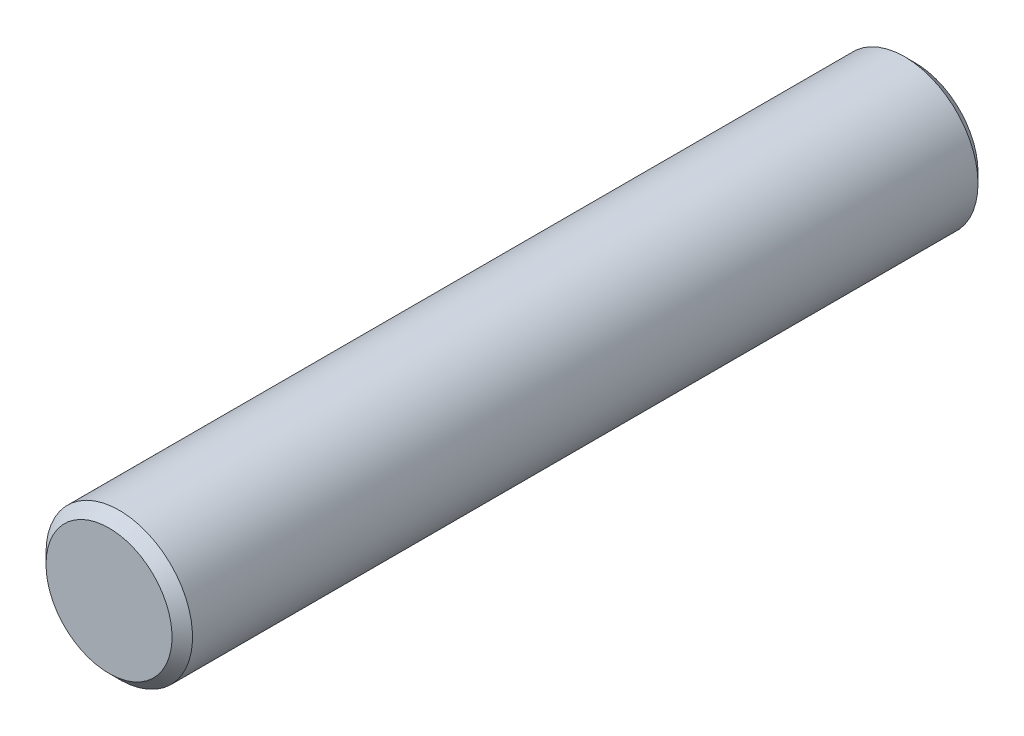
ISO-10303-21;
HEADER;
FILE_DESCRIPTION(('STEP AP214'),'2;1');
FILE_NAME('part.step','',(''),(''),'','','');
FILE_SCHEMA(('AUTOMOTIVE_DESIGN { 1 0 10303 214 1 1 1 1 }'));
ENDSEC;
DATA;
#1=APPLICATION_CONTEXT('core data for automotive mechanical design processes');
#2=APPLICATION_PROTOCOL_DEFINITION('international standard','automotive_design',2000,#1);
#3=PRODUCT_CONTEXT('',#1,'mechanical');
#4=PRODUCT('Part','Part','',(#3));
#5=PRODUCT_RELATED_PRODUCT_CATEGORY('part','',(#4));
#6=PRODUCT_DEFINITION_FORMATION('','',#4);
#7=PRODUCT_DEFINITION_CONTEXT('part definition',#1,'design');
#8=PRODUCT_DEFINITION('design','',#6,#7);
#9=PRODUCT_DEFINITION_SHAPE('','',#8);
#10=(LENGTH_UNIT() NAMED_UNIT(*) SI_UNIT(.MILLI.,.METRE.));
#11=(NAMED_UNIT(*) PLANE_ANGLE_UNIT() SI_UNIT($,.RADIAN.));
#12=(NAMED_UNIT(*) SI_UNIT($,.STERADIAN.) SOLID_ANGLE_UNIT());
#13=UNCERTAINTY_MEASURE_WITH_UNIT(LENGTH_MEASURE(1.E-05),#10,'distance_accuracy_value','');
#14=(GEOMETRIC_REPRESENTATION_CONTEXT(3) GLOBAL_UNCERTAINTY_ASSIGNED_CONTEXT((#13)) GLOBAL_UNIT_ASSIGNED_CONTEXT((#10,
#11,#12)) REPRESENTATION_CONTEXT('',''));
#15=CARTESIAN_POINT('',(0.,0.,0.));
#16=DIRECTION('',(0.,0.,1.));
#17=DIRECTION('',(1.,0.,0.));
#18=AXIS2_PLACEMENT_3D('',#15,#16,#17);
#19=CARTESIAN_POINT('',(0.,0.,55.));
#20=DIRECTION('',(0.,0.,-1.));
#21=DIRECTION('',(-1.,0.,0.));
#22=AXIS2_PLACEMENT_3D('',#19,#20,#21);
#23=CYLINDRICAL_SURFACE('',#22,5.);
#24=CARTESIAN_POINT('',(0.,0.,0.699999999999999));
#25=DIRECTION('',(0.,0.,1.));
#26=DIRECTION('',(1.,0.,0.));
#27=AXIS2_PLACEMENT_3D('',#24,#25,#26);
#28=CIRCLE('',#27,5.);
#29=CARTESIAN_POINT('',(-5.,0.,0.699999999999999));
#30=VERTEX_POINT('',#29);
#31=EDGE_CURVE('E38',#30,#30,#28,.T.);
#32=CARTESIAN_POINT('',(0.,0.,54.3));
#33=DIRECTION('',(0.,0.,1.));
#34=DIRECTION('',(1.,0.,0.));
#35=AXIS2_PLACEMENT_3D('',#32,#33,#34);
#36=CIRCLE('',#35,5.);
#37=CARTESIAN_POINT('',(-5.,0.,54.3));
#38=VERTEX_POINT('',#37);
#39=EDGE_CURVE('E42',#38,#38,#36,.F.);
#40=CARTESIAN_POINT('',(-5.,0.,0.699999999999999));
#41=CARTESIAN_POINT('',(-5.,0.,1.25833333333333));
#42=CARTESIAN_POINT('',(-5.,0.,1.81666666666667));
#43=CARTESIAN_POINT('',(-5.,0.,2.93333333333333));
#44=CARTESIAN_POINT('',(-5.,0.,3.49166666666667));
#45=CARTESIAN_POINT('',(-5.,0.,4.60833333333333));
#46=CARTESIAN_POINT('',(-5.,0.,5.16666666666667));
#47=CARTESIAN_POINT('',(-5.,0.,6.28333333333333));
#48=CARTESIAN_POINT('',(-5.,0.,6.84166666666667));
#49=CARTESIAN_POINT('',(-5.,0.,7.95833333333333));
#50=CARTESIAN_POINT('',(-5.,0.,8.51666666666667));
#51=CARTESIAN_POINT('',(-5.,0.,9.63333333333333));
#52=CARTESIAN_POINT('',(-5.,0.,10.1916666666667));
#53=CARTESIAN_POINT('',(-5.,0.,11.3083333333333));
#54=CARTESIAN_POINT('',(-5.,0.,11.8666666666667));
#55=CARTESIAN_POINT('',(-5.,0.,12.9833333333333));
#56=CARTESIAN_POINT('',(-5.,0.,13.5416666666667));
#57=CARTESIAN_POINT('',(-5.,0.,14.6583333333333));
#58=CARTESIAN_POINT('',(-5.,0.,15.2166666666667));
#59=CARTESIAN_POINT('',(-5.,0.,16.3333333333333));
#60=CARTESIAN_POINT('',(-5.,0.,16.8916666666667));
#61=CARTESIAN_POINT('',(-5.,0.,18.0083333333333));
#62=CARTESIAN_POINT('',(-5.,0.,18.5666666666667));
#63=CARTESIAN_POINT('',(-5.,0.,19.6833333333333));
#64=CARTESIAN_POINT('',(-5.,0.,20.2416666666667));
#65=CARTESIAN_POINT('',(-5.,0.,21.3583333333333));
#66=CARTESIAN_POINT('',(-5.,0.,21.9166666666667));
#67=CARTESIAN_POINT('',(-5.,0.,23.0333333333333));
#68=CARTESIAN_POINT('',(-5.,0.,23.5916666666667));
#69=CARTESIAN_POINT('',(-5.,0.,24.7083333333333));
#70=CARTESIAN_POINT('',(-5.,0.,25.2666666666667));
#71=CARTESIAN_POINT('',(-5.,0.,26.3833333333333));
#72=CARTESIAN_POINT('',(-5.,0.,26.9416666666667));
#73=CARTESIAN_POINT('',(-5.,0.,28.0583333333333));
#74=CARTESIAN_POINT('',(-5.,0.,28.6166666666667));
#75=CARTESIAN_POINT('',(-5.,0.,29.7333333333333));
#76=CARTESIAN_POINT('',(-5.,0.,30.2916666666667));
#77=CARTESIAN_POINT('',(-5.,0.,31.4083333333333));
#78=CARTESIAN_POINT('',(-5.,0.,31.9666666666667));
#79=CARTESIAN_POINT('',(-5.,0.,33.0833333333333));
#80=CARTESIAN_POINT('',(-5.,0.,33.6416666666667));
#81=CARTESIAN_POINT('',(-5.,0.,34.7583333333333));
#82=CARTESIAN_POINT('',(-5.,0.,35.3166666666667));
#83=CARTESIAN_POINT('',(-5.,0.,36.4333333333333));
#84=CARTESIAN_POINT('',(-5.,0.,36.9916666666667));
#85=CARTESIAN_POINT('',(-5.,0.,38.1083333333333));
#86=CARTESIAN_POINT('',(-5.,0.,38.6666666666667));
#87=CARTESIAN_POINT('',(-5.,0.,39.7833333333333));
#88=CARTESIAN_POINT('',(-5.,0.,40.3416666666667));
#89=CARTESIAN_POINT('',(-5.,0.,41.4583333333333));
#90=CARTESIAN_POINT('',(-5.,0.,42.0166666666667));
#91=CARTESIAN_POINT('',(-5.,0.,43.1333333333333));
#92=CARTESIAN_POINT('',(-5.,0.,43.6916666666667));
#93=CARTESIAN_POINT('',(-5.,0.,44.8083333333333));
#94=CARTESIAN_POINT('',(-5.,0.,45.3666666666667));
#95=CARTESIAN_POINT('',(-5.,0.,46.4833333333333));
#96=CARTESIAN_POINT('',(-5.,0.,47.0416666666667));
#97=CARTESIAN_POINT('',(-5.,0.,48.1583333333333));
#98=CARTESIAN_POINT('',(-5.,0.,48.7166666666667));
#99=CARTESIAN_POINT('',(-5.,0.,49.8333333333333));
#100=CARTESIAN_POINT('',(-5.,0.,50.3916666666667));
#101=CARTESIAN_POINT('',(-5.,0.,51.5083333333333));
#102=CARTESIAN_POINT('',(-5.,0.,52.0666666666667));
#103=CARTESIAN_POINT('',(-5.,0.,53.1833333333333));
#104=CARTESIAN_POINT('',(-5.,0.,53.7416666666667));
#105=CARTESIAN_POINT('',(-5.,0.,54.3));
#106=B_SPLINE_CURVE_WITH_KNOTS('',3,(#40,#41,#42,#43,#44,#45,#46,#47,#48,#49,#50,#51,#52,#53,
#54,#55,#56,#57,#58,#59,#60,#61,#62,#63,#64,#65,#66,#67,#68,#69,#70,#71,#72,#73,#74,#75,#76,#77,
#78,#79,#80,#81,#82,#83,#84,#85,#86,#87,#88,#89,#90,#91,#92,#93,#94,#95,#96,#97,#98,#99,#100,
#101,#102,#103,#104,#105),.UNSPECIFIED.,.F.,.F.,(4,2,2,2,2,2,2,2,2,2,2,2,2,2,2,2,2,2,2,2,2,2,2,
2,2,2,2,2,2,2,2,2,4),(0.,1.675,3.35,5.025,6.7,8.375,10.05,11.725,13.4,15.075,16.75,18.425,20.1,
21.775,23.45,25.125,26.8,28.475,30.15,31.825,33.5,35.175,36.85,38.525,40.2,41.875,43.55,45.225,
46.9,48.575,50.25,51.925,53.6),.UNSPECIFIED.);
#107=EDGE_CURVE('BSEAM28',#30,#38,#106,.T.);
#108=ORIENTED_EDGE('',*,*,#31,.T.);
#109=ORIENTED_EDGE('',*,*,#39,.T.);
#110=ORIENTED_EDGE('',*,*,#107,.T.);
#111=ORIENTED_EDGE('',*,*,#107,.F.);
#112=EDGE_LOOP('',(#108,#110,#109,#111));
#113=FACE_BOUND('',#112,.T.);
#114=ADVANCED_FACE('F28',(#113),#23,.T.);
#115=CARTESIAN_POINT('',(0.,0.,55.));
#116=DIRECTION('',(0.,0.,1.));
#117=DIRECTION('',(1.,0.,0.));
#118=AXIS2_PLACEMENT_3D('',#115,#116,#117);
#119=PLANE('',#118);
#120=CARTESIAN_POINT('',(0.,0.,55.));
#121=DIRECTION('',(0.,0.,1.));
#122=DIRECTION('',(1.,0.,0.));
#123=AXIS2_PLACEMENT_3D('',#120,#121,#122);
#124=CIRCLE('',#123,4.3);
#125=CARTESIAN_POINT('',(-4.3,0.,55.));
#126=VERTEX_POINT('',#125);
#127=EDGE_CURVE('E10',#126,#126,#124,.T.);
#128=ORIENTED_EDGE('',*,*,#127,.T.);
#129=EDGE_LOOP('',(#128));
#130=FACE_BOUND('',#129,.T.);
#131=ADVANCED_FACE('F61',(#130),#119,.T.);
#132=CARTESIAN_POINT('',(0.,0.,0.));
#133=DIRECTION('',(0.,0.,1.));
#134=DIRECTION('',(1.,0.,0.));
#135=AXIS2_PLACEMENT_3D('',#132,#133,#134);
#136=PLANE('',#135);
#137=CARTESIAN_POINT('',(0.,0.,0.));
#138=DIRECTION('',(0.,0.,1.));
#139=DIRECTION('',(1.,0.,0.));
#140=AXIS2_PLACEMENT_3D('',#137,#138,#139);
#141=CIRCLE('',#140,4.3);
#142=CARTESIAN_POINT('',(4.3,0.,0.));
#143=VERTEX_POINT('',#142);
#144=EDGE_CURVE('E34',#143,#143,#141,.F.);
#145=ORIENTED_EDGE('',*,*,#144,.T.);
#146=EDGE_LOOP('',(#145));
#147=FACE_BOUND('',#146,.T.);
#148=ADVANCED_FACE('F57',(#147),#136,.F.);
#149=CARTESIAN_POINT('',(0.,0.,0.699999999999999));
#150=DIRECTION('',(0.,0.,1.));
#151=DIRECTION('',(1.,0.,0.));
#152=AXIS2_PLACEMENT_3D('',#149,#150,#151);
#153=CONICAL_SURFACE('',#152,5.,0.785398163397451);
#154=ORIENTED_EDGE('',*,*,#144,.F.);
#155=EDGE_LOOP('',(#154));
#156=FACE_BOUND('',#155,.T.);
#157=ORIENTED_EDGE('',*,*,#31,.F.);
#158=EDGE_LOOP('',(#157));
#159=FACE_BOUND('',#158,.T.);
#160=ADVANCED_FACE('F52',(#156,#159),#153,.T.);
#161=CARTESIAN_POINT('',(0.,0.,55.));
#162=DIRECTION('',(0.,0.,-1.));
#163=DIRECTION('',(-1.,0.,0.));
#164=AXIS2_PLACEMENT_3D('',#161,#162,#163);
#165=CONICAL_SURFACE('',#164,4.3,0.785398163397451);
#166=CARTESIAN_POINT('',(-5.,0.,54.3));
#167=CARTESIAN_POINT('',(-4.99270833333334,0.,54.3072916666667));
#168=CARTESIAN_POINT('',(-4.98541666666667,0.,54.3145833333333));
#169=CARTESIAN_POINT('',(-4.97083333333334,0.,54.3291666666667));
#170=CARTESIAN_POINT('',(-4.96354166666667,0.,54.3364583333333));
#171=CARTESIAN_POINT('',(-4.94895833333334,0.,54.3510416666667));
#172=CARTESIAN_POINT('',(-4.94166666666667,0.,54.3583333333333));
#173=CARTESIAN_POINT('',(-4.92708333333334,0.,54.3729166666667));
#174=CARTESIAN_POINT('',(-4.91979166666667,0.,54.3802083333333));
#175=CARTESIAN_POINT('',(-4.90520833333334,0.,54.3947916666667));
#176=CARTESIAN_POINT('',(-4.89791666666667,0.,54.4020833333333));
#177=CARTESIAN_POINT('',(-4.88333333333334,0.,54.4166666666667));
#178=CARTESIAN_POINT('',(-4.87604166666667,0.,54.4239583333333));
#179=CARTESIAN_POINT('',(-4.86145833333334,0.,54.4385416666667));
#180=CARTESIAN_POINT('',(-4.85416666666667,0.,54.4458333333333));
#181=CARTESIAN_POINT('',(-4.83958333333334,0.,54.4604166666667));
#182=CARTESIAN_POINT('',(-4.83229166666667,0.,54.4677083333333));
#183=CARTESIAN_POINT('',(-4.81770833333334,0.,54.4822916666667));
#184=CARTESIAN_POINT('',(-4.81041666666667,0.,54.4895833333333));
#185=CARTESIAN_POINT('',(-4.79583333333334,0.,54.5041666666667));
#186=CARTESIAN_POINT('',(-4.78854166666667,0.,54.5114583333333));
#187=CARTESIAN_POINT('',(-4.77395833333334,0.,54.5260416666667));
#188=CARTESIAN_POINT('',(-4.76666666666667,0.,54.5333333333333));
#189=CARTESIAN_POINT('',(-4.75208333333334,0.,54.5479166666667));
#190=CARTESIAN_POINT('',(-4.74479166666667,0.,54.5552083333333));
#191=CARTESIAN_POINT('',(-4.73020833333334,0.,54.5697916666667));
#192=CARTESIAN_POINT('',(-4.72291666666667,0.,54.5770833333333));
#193=CARTESIAN_POINT('',(-4.70833333333334,0.,54.5916666666667));
#194=CARTESIAN_POINT('',(-4.70104166666667,0.,54.5989583333333));
#195=CARTESIAN_POINT('',(-4.68645833333334,0.,54.6135416666667));
#196=CARTESIAN_POINT('',(-4.67916666666667,0.,54.6208333333333));
#197=CARTESIAN_POINT('',(-4.66458333333334,0.,54.6354166666667));
#198=CARTESIAN_POINT('',(-4.65729166666667,0.,54.6427083333333));
#199=CARTESIAN_POINT('',(-4.64270833333334,0.,54.6572916666667));
#200=CARTESIAN_POINT('',(-4.63541666666667,0.,54.6645833333333));
#201=CARTESIAN_POINT('',(-4.62083333333334,0.,54.6791666666667));
#202=CARTESIAN_POINT('',(-4.61354166666667,0.,54.6864583333333));
#203=CARTESIAN_POINT('',(-4.59895833333334,0.,54.7010416666667));
#204=CARTESIAN_POINT('',(-4.59166666666667,0.,54.7083333333333));
#205=CARTESIAN_POINT('',(-4.57708333333334,0.,54.7229166666667));
#206=CARTESIAN_POINT('',(-4.56979166666667,0.,54.7302083333333));
#207=CARTESIAN_POINT('',(-4.55520833333334,0.,54.7447916666667));
#208=CARTESIAN_POINT('',(-4.54791666666667,0.,54.7520833333333));
#209=CARTESIAN_POINT('',(-4.53333333333334,0.,54.7666666666667));
#210=CARTESIAN_POINT('',(-4.52604166666667,0.,54.7739583333333));
#211=CARTESIAN_POINT('',(-4.51145833333334,0.,54.7885416666667));
#212=CARTESIAN_POINT('',(-4.50416666666667,0.,54.7958333333333));
#213=CARTESIAN_POINT('',(-4.48958333333334,0.,54.8104166666667));
#214=CARTESIAN_POINT('',(-4.48229166666667,0.,54.8177083333333));
#215=CARTESIAN_POINT('',(-4.46770833333334,0.,54.8322916666667));
#216=CARTESIAN_POINT('',(-4.46041666666667,0.,54.8395833333333));
#217=CARTESIAN_POINT('',(-4.44583333333334,0.,54.8541666666667));
#218=CARTESIAN_POINT('',(-4.43854166666667,0.,54.8614583333333));
#219=CARTESIAN_POINT('',(-4.42395833333333,0.,54.8760416666667));
#220=CARTESIAN_POINT('',(-4.41666666666667,0.,54.8833333333333));
#221=CARTESIAN_POINT('',(-4.40208333333334,0.,54.8979166666667));
#222=CARTESIAN_POINT('',(-4.39479166666667,0.,54.9052083333333));
#223=CARTESIAN_POINT('',(-4.38020833333334,0.,54.9197916666667));
#224=CARTESIAN_POINT('',(-4.37291666666667,0.,54.9270833333333));
#225=CARTESIAN_POINT('',(-4.35833333333334,0.,54.9416666666667));
#226=CARTESIAN_POINT('',(-4.35104166666667,0.,54.9489583333333));
#227=CARTESIAN_POINT('',(-4.33645833333334,0.,54.9635416666667));
#228=CARTESIAN_POINT('',(-4.32916666666667,0.,54.9708333333333));
#229=CARTESIAN_POINT('',(-4.31458333333333,0.,54.9854166666667));
#230=CARTESIAN_POINT('',(-4.30729166666667,0.,54.9927083333333));
#231=CARTESIAN_POINT('',(-4.3,0.,55.));
#232=B_SPLINE_CURVE_WITH_KNOTS('',3,(#166,#167,#168,#169,#170,#171,#172,#173,#174,#175,#176,
#177,#178,#179,#180,#181,#182,#183,#184,#185,#186,#187,#188,#189,#190,#191,#192,#193,#194,#195,
#196,#197,#198,#199,#200,#201,#202,#203,#204,#205,#206,#207,#208,#209,#210,#211,#212,#213,#214,
#215,#216,#217,#218,#219,#220,#221,#222,#223,#224,#225,#226,#227,#228,#229,#230,#231),
.UNSPECIFIED.,.F.,.F.,(4,2,2,2,2,2,2,2,2,2,2,2,2,2,2,2,2,2,2,2,2,2,2,2,2,2,2,2,2,2,2,2,4),(0.,
0.0309359216769142,0.0618718433538241,0.0928077650307389,0.123743686707649,0.154679608384559,
0.185615530061473,0.216551451738383,0.247487373415293,0.278423295092208,0.309359216769117,
0.340295138446027,0.371231060122942,0.402166981799852,0.433102903476762,0.464038825153677,
0.494974746830586,0.525910668507496,0.556846590184411,0.58778251186132,0.61871843353823,
0.649654355215145,0.680590276892055,0.711526198568965,0.742462120245879,0.773398041922789,
0.804333963599699,0.835269885276614,0.866205806953523,0.897141728630433,0.928077650307348,
0.959013571984258,0.989949493661172),.UNSPECIFIED.);
#233=EDGE_CURVE('BSEAM49',#38,#126,#232,.T.);
#234=ORIENTED_EDGE('',*,*,#39,.F.);
#235=ORIENTED_EDGE('',*,*,#127,.F.);
#236=ORIENTED_EDGE('',*,*,#233,.T.);
#237=ORIENTED_EDGE('',*,*,#233,.F.);
#238=EDGE_LOOP('',(#234,#236,#235,#237));
#239=FACE_BOUND('',#238,.T.);
#240=ADVANCED_FACE('F49',(#239),#165,.T.);
#241=CLOSED_SHELL('',(#114,#131,#148,#160,#240));
#242=MANIFOLD_SOLID_BREP('B2',#241);
#243=ADVANCED_BREP_SHAPE_REPRESENTATION('',(#18,#242),#14);
#244=SHAPE_DEFINITION_REPRESENTATION(#9,#243);
ENDSEC;
END-ISO-10303-21;
